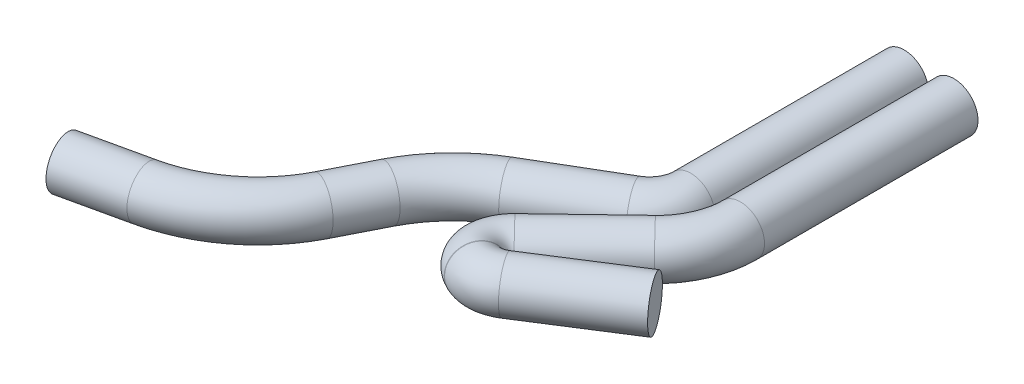
ISO-10303-21;
HEADER;
FILE_DESCRIPTION(('STEP AP214'),'2;1');
FILE_NAME('part.step','',(''),(''),'','','');
FILE_SCHEMA(('AUTOMOTIVE_DESIGN { 1 0 10303 214 1 1 1 1 }'));
ENDSEC;
DATA;
#1=APPLICATION_CONTEXT('core data for automotive mechanical design processes');
#2=APPLICATION_PROTOCOL_DEFINITION('international standard','automotive_design',2000,#1);
#3=PRODUCT_CONTEXT('',#1,'mechanical');
#4=PRODUCT('Part','Part','',(#3));
#5=PRODUCT_RELATED_PRODUCT_CATEGORY('part','',(#4));
#6=PRODUCT_DEFINITION_FORMATION('','',#4);
#7=PRODUCT_DEFINITION_CONTEXT('part definition',#1,'design');
#8=PRODUCT_DEFINITION('design','',#6,#7);
#9=PRODUCT_DEFINITION_SHAPE('','',#8);
#10=(LENGTH_UNIT() NAMED_UNIT(*) SI_UNIT(.MILLI.,.METRE.));
#11=(NAMED_UNIT(*) PLANE_ANGLE_UNIT() SI_UNIT($,.RADIAN.));
#12=(NAMED_UNIT(*) SI_UNIT($,.STERADIAN.) SOLID_ANGLE_UNIT());
#13=UNCERTAINTY_MEASURE_WITH_UNIT(LENGTH_MEASURE(1.E-05),#10,'distance_accuracy_value','');
#14=(GEOMETRIC_REPRESENTATION_CONTEXT(3) GLOBAL_UNCERTAINTY_ASSIGNED_CONTEXT((#13)) GLOBAL_UNIT_ASSIGNED_CONTEXT((#10,
#11,#12)) REPRESENTATION_CONTEXT('',''));
#15=CARTESIAN_POINT('',(0.,0.,0.));
#16=DIRECTION('',(0.,0.,1.));
#17=DIRECTION('',(1.,0.,0.));
#18=AXIS2_PLACEMENT_3D('',#15,#16,#17);
#19=CARTESIAN_POINT('',(-21.6730241089946,0.500000000000016,25.2337808568978));
#20=DIRECTION('',(-0.976296007119932,0.,0.216439613938107));
#21=DIRECTION('',(0.216439613938107,0.,0.976296007119932));
#22=AXIS2_PLACEMENT_3D('',#19,#20,#21);
#23=CYLINDRICAL_SURFACE('',#22,1.75);
#24=CARTESIAN_POINT('',(-21.6730241089946,0.500000000000016,25.2337808568978));
#25=DIRECTION('',(-0.976296007119932,0.,0.216439613938108));
#26=DIRECTION('',(0.216433231921712,0.00767931316880695,0.976267219704307));
#27=AXIS2_PLACEMENT_3D('',#24,#25,#26);
#28=CIRCLE('',#27,1.75);
#29=CARTESIAN_POINT('',(-21.2947599299172,0.590350167886694,26.9400203060929));
#30=VERTEX_POINT('',#29);
#31=EDGE_CURVE('E104',#30,#30,#28,.T.);
#32=ORIENTED_EDGE('',*,*,#31,.T.);
#33=EDGE_LOOP('',(#32));
#34=FACE_BOUND('',#33,.T.);
#35=CARTESIAN_POINT('',(-26.4820698293765,0.500000000000019,26.2999206255124));
#36=DIRECTION('',(-0.976296007119932,0.,0.216439613938108));
#37=DIRECTION('',(0.216439613938108,0.,0.976296007119932));
#38=AXIS2_PLACEMENT_3D('',#35,#36,#37);
#39=CIRCLE('',#38,1.75);
#40=CARTESIAN_POINT('',(-26.1033005049849,0.500000000000019,28.0084386379723));
#41=VERTEX_POINT('',#40);
#42=EDGE_CURVE('E341',#41,#41,#39,.T.);
#43=ORIENTED_EDGE('',*,*,#42,.F.);
#44=EDGE_LOOP('',(#43));
#45=FACE_BOUND('',#44,.T.);
#46=ADVANCED_FACE('F37',(#34,#45),#23,.T.);
#47=CARTESIAN_POINT('',(-1.8,0.,-10.));
#48=DIRECTION('',(0.,0.,1.));
#49=DIRECTION('',(1.,0.,0.));
#50=AXIS2_PLACEMENT_3D('',#47,#48,#49);
#51=CYLINDRICAL_SURFACE('',#50,1.75);
#52=CARTESIAN_POINT('',(-1.8,0.,-10.));
#53=DIRECTION('',(0.,0.,1.));
#54=DIRECTION('',(1.,0.,0.));
#55=AXIS2_PLACEMENT_3D('',#52,#53,#54);
#56=CIRCLE('',#55,1.75);
#57=CARTESIAN_POINT('',(-0.0499999999999997,0.,-10.));
#58=VERTEX_POINT('',#57);
#59=EDGE_CURVE('E64',#58,#58,#56,.T.);
#60=ORIENTED_EDGE('',*,*,#59,.T.);
#61=EDGE_LOOP('',(#60));
#62=FACE_BOUND('',#61,.T.);
#63=CARTESIAN_POINT('',(-1.8,0.,5.5));
#64=DIRECTION('',(0.,0.,1.));
#65=DIRECTION('',(1.,0.,0.));
#66=AXIS2_PLACEMENT_3D('',#63,#64,#65);
#67=CIRCLE('',#66,1.75);
#68=CARTESIAN_POINT('',(-0.0499999999999995,0.,5.5));
#69=VERTEX_POINT('',#68);
#70=EDGE_CURVE('E89',#69,#69,#67,.T.);
#71=ORIENTED_EDGE('',*,*,#70,.F.);
#72=EDGE_LOOP('',(#71));
#73=FACE_BOUND('',#72,.T.);
#74=ADVANCED_FACE('F39',(#62,#73),#51,.T.);
#75=CARTESIAN_POINT('',(-1.8,0.,-10.));
#76=DIRECTION('',(0.,0.,1.));
#77=DIRECTION('',(1.,0.,0.));
#78=AXIS2_PLACEMENT_3D('',#75,#76,#77);
#79=PLANE('',#78);
#80=ORIENTED_EDGE('',*,*,#59,.F.);
#81=EDGE_LOOP('',(#80));
#82=FACE_BOUND('',#81,.T.);
#83=ADVANCED_FACE('F155',(#82),#79,.F.);
#84=CARTESIAN_POINT('',(-23.8345337037226,-0.016286673638144,15.4838411472113));
#85=DIRECTION('',(0.0111744888323627,-0.998666351043349,0.0504048618002169));
#86=DIRECTION('',(0.,-0.050408009102372,-0.99872870821777));
#87=AXIS2_PLACEMENT_3D('',#84,#85,#86);
#88=TOROIDAL_SURFACE('',#87,10.,1.75);
#89=CARTESIAN_POINT('',(-14.6790347620915,0.288575292282886,19.4943147241753));
#90=DIRECTION('',(-0.40204915383228,0.0416666666666678,0.914669539665357));
#91=DIRECTION('',(0.915156111314764,-0.0134427207983108,0.402875396594006));
#92=AXIS2_PLACEMENT_3D('',#89,#90,#91);
#93=CIRCLE('',#92,1.75);
#94=CARTESIAN_POINT('',(-13.076822447306,0.341926136319067,20.196147600144));
#95=VERTEX_POINT('',#94);
#96=EDGE_CURVE('E101',#95,#95,#93,.T.);
#97=CARTESIAN_POINT('',(-23.8345337037226,-0.016286673638144,15.4838411472113));
#98=DIRECTION('',(0.0111744888323627,-0.998666351043349,0.0504048618002169));
#99=DIRECTION('',(0.,-0.050408009102372,-0.99872870821777));
#100=AXIS2_PLACEMENT_3D('',#97,#98,#99);
#101=CIRCLE('',#100,11.75);
#102=EDGE_CURVE('',#95,#30,#101,.T.);
#103=ORIENTED_EDGE('',*,*,#96,.T.);
#104=ORIENTED_EDGE('',*,*,#31,.F.);
#105=ORIENTED_EDGE('',*,*,#102,.T.);
#106=ORIENTED_EDGE('',*,*,#102,.F.);
#107=EDGE_LOOP('',(#103,#105,#104,#106));
#108=FACE_BOUND('',#107,.T.);
#109=ADVANCED_FACE('F159',(#108),#88,.T.);
#110=CARTESIAN_POINT('',(-13.1949278399274,0.134768754365635,16.1179429985523));
#111=DIRECTION('',(-0.402049153832282,0.0416666666666677,0.914669539665356));
#112=DIRECTION('',(0.915464558972045,0.,0.402398609920709));
#113=AXIS2_PLACEMENT_3D('',#110,#111,#112);
#114=CYLINDRICAL_SURFACE('',#113,1.75);
#115=CARTESIAN_POINT('',(-13.1949278399274,0.134768754365635,16.1179429985523));
#116=DIRECTION('',(-0.40204915383228,0.0416666666666678,0.914669539665357));
#117=DIRECTION('',(0.915156111314764,-0.0134427207983108,0.402875396594006));
#118=AXIS2_PLACEMENT_3D('',#115,#116,#117);
#119=CIRCLE('',#118,1.75);
#120=CARTESIAN_POINT('',(-14.7960133175948,0.0338422207240908,15.4187726845302));
#121=VERTEX_POINT('',#120);
#122=EDGE_CURVE('E98',#121,#121,#119,.T.);
#123=ORIENTED_EDGE('',*,*,#122,.T.);
#124=EDGE_LOOP('',(#123));
#125=FACE_BOUND('',#124,.T.);
#126=ORIENTED_EDGE('',*,*,#96,.F.);
#127=EDGE_LOOP('',(#126));
#128=FACE_BOUND('',#127,.T.);
#129=ADVANCED_FACE('F166',(#125,#128),#114,.T.);
#130=CARTESIAN_POINT('',(-4.04586796754242,0.71149180374589,20.1132019358213));
#131=DIRECTION('',(-0.0361041883704825,0.997465685691505,-0.0613081842014956));
#132=DIRECTION('',(0.,0.0613481812979924,0.998116426400963));
#133=AXIS2_PLACEMENT_3D('',#130,#131,#132);
#134=TOROIDAL_SURFACE('',#133,10.,1.75);
#135=CARTESIAN_POINT('',(-9.10744265044075,0.,11.5181893620873));
#136=DIRECTION('',(-0.861685038094858,0.,0.507443489586243));
#137=DIRECTION('',(0.507443489586243,0.,0.861685038094858));
#138=AXIS2_PLACEMENT_3D('',#135,#136,#137);
#139=CIRCLE('',#138,1.75);
#140=CARTESIAN_POINT('',(-9.99321821994795,-0.124511065655531,10.0140621616839));
#141=VERTEX_POINT('',#140);
#142=EDGE_CURVE('E95',#141,#141,#139,.T.);
#143=CARTESIAN_POINT('',(-4.04586796754242,0.71149180374589,20.1132019358213));
#144=DIRECTION('',(-0.0361041883704825,0.997465685691505,-0.0613081842014956));
#145=DIRECTION('',(0.,0.0613481812979924,0.998116426400963));
#146=AXIS2_PLACEMENT_3D('',#143,#144,#145);
#147=CIRCLE('',#146,11.75);
#148=EDGE_CURVE('',#141,#121,#147,.T.);
#149=ORIENTED_EDGE('',*,*,#142,.T.);
#150=ORIENTED_EDGE('',*,*,#122,.F.);
#151=ORIENTED_EDGE('',*,*,#148,.T.);
#152=ORIENTED_EDGE('',*,*,#148,.F.);
#153=EDGE_LOOP('',(#149,#151,#150,#152));
#154=FACE_BOUND('',#153,.T.);
#155=ADVANCED_FACE('F178',(#154),#134,.T.);
#156=CARTESIAN_POINT('',(-3.27766953124127,0.,8.08505511428457));
#157=DIRECTION('',(-0.861685038094857,0.,0.507443489586244));
#158=DIRECTION('',(0.507443489586244,0.,0.861685038094857));
#159=AXIS2_PLACEMENT_3D('',#156,#157,#158);
#160=CYLINDRICAL_SURFACE('',#159,1.75);
#161=CARTESIAN_POINT('',(-3.27766953124127,0.,8.08505511428457));
#162=DIRECTION('',(-0.861685038094858,0.,0.507443489586243));
#163=DIRECTION('',(0.507443489586243,0.,0.861685038094858));
#164=AXIS2_PLACEMENT_3D('',#161,#162,#163);
#165=CIRCLE('',#164,1.75);
#166=CARTESIAN_POINT('',(-2.38964342446534,0.,9.59300393095057));
#167=VERTEX_POINT('',#166);
#168=EDGE_CURVE('E92',#167,#167,#165,.T.);
#169=ORIENTED_EDGE('',*,*,#168,.T.);
#170=EDGE_LOOP('',(#169));
#171=FACE_BOUND('',#170,.T.);
#172=ORIENTED_EDGE('',*,*,#142,.F.);
#173=EDGE_LOOP('',(#172));
#174=FACE_BOUND('',#173,.T.);
#175=ADVANCED_FACE('F173',(#171,#174),#160,.T.);
#176=CARTESIAN_POINT('',(-4.8,0.,5.5));
#177=DIRECTION('',(0.,-1.,0.));
#178=DIRECTION('',(0.,0.,-1.));
#179=AXIS2_PLACEMENT_3D('',#176,#177,#178);
#180=TOROIDAL_SURFACE('',#179,3.,1.75);
#181=CARTESIAN_POINT('',(-0.999341230949511,0.18416013869741,8.33289183997176));
#182=CARTESIAN_POINT('',(-1.01201693799096,0.199116564470194,8.34723658798658));
#183=CARTESIAN_POINT('',(-1.02538865045457,0.212649292814823,8.36227541868743));
#184=CARTESIAN_POINT('',(-1.05311412252572,0.237333805152229,8.39324639939902));
#185=CARTESIAN_POINT('',(-1.06746387706323,0.248494609696739,8.40917486304715));
#186=CARTESIAN_POINT('',(-1.11124016944338,0.279066913592445,8.45741882562102));
#187=CARTESIAN_POINT('',(-1.14165417137557,0.295838701702347,8.49048878492593));
#188=CARTESIAN_POINT('',(-1.18695530793059,0.316493047418901,8.53901910366807));
#189=CARTESIAN_POINT('',(-1.20125909176298,0.322414989648062,8.55424177260462));
#190=CARTESIAN_POINT('',(-1.24997805227185,0.34080326904788,8.60574166904313));
#191=CARTESIAN_POINT('',(-1.28503334719416,0.351087204193428,8.64222107634737));
#192=CARTESIAN_POINT('',(-1.35622983110374,0.367307071372705,8.71510896500459));
#193=CARTESIAN_POINT('',(-1.39237258396124,0.373236396151344,8.75151725532436));
#194=CARTESIAN_POINT('',(-1.50234724472071,0.38527257444411,8.86047877851621));
#195=CARTESIAN_POINT('',(-1.5774680965545,0.385541045793297,8.93249586529784));
#196=CARTESIAN_POINT('',(-1.70441817210852,0.373058808175953,9.05024940163594));
#197=CARTESIAN_POINT('',(-1.75587259900185,0.364515967425142,9.09691226368289));
#198=CARTESIAN_POINT('',(-1.85845034954278,0.339199686774759,9.18791824376531));
#199=CARTESIAN_POINT('',(-1.9095736245079,0.322480763249914,9.23227460316582));
#200=CARTESIAN_POINT('',(-1.97722706251196,0.292210517800513,9.28976908584691));
#201=CARTESIAN_POINT('',(-1.99466829996976,0.283649347079344,9.30447935817896));
#202=CARTESIAN_POINT('',(-2.02919321888413,0.264783179110377,9.33339188382785));
#203=CARTESIAN_POINT('',(-2.04627499623965,0.254470697008226,9.34759162556335));
#204=CARTESIAN_POINT('',(-2.08388595817449,0.228936927283499,9.3786431775259));
#205=CARTESIAN_POINT('',(-2.10421022913854,0.213132927592518,9.39527125949946));
#206=CARTESIAN_POINT('',(-2.14253439555145,0.177203655838755,9.42638355205068));
#207=CARTESIAN_POINT('',(-2.16055149320483,0.157113754941245,9.44088376294909));
#208=CARTESIAN_POINT('',(-2.18185481585708,0.125600934754252,9.45793050665013));
#209=CARTESIAN_POINT('',(-2.18729886830631,0.116632036933378,9.46227519775079));
#210=CARTESIAN_POINT('',(-2.19722648393701,0.0978395656506297,9.47018332006891));
#211=CARTESIAN_POINT('',(-2.20170998374762,0.0880159358593348,9.47374669974103));
#212=CARTESIAN_POINT('',(-2.20944465367369,0.0674414031575244,9.47988563244145));
#213=CARTESIAN_POINT('',(-2.21268057559162,0.0566808834761982,9.48244896692395));
#214=CARTESIAN_POINT('',(-2.2174888415854,0.0345718542987436,9.48625527557658));
#215=CARTESIAN_POINT('',(-2.21906423783449,0.0232244639499628,9.4875006722342));
#216=CARTESIAN_POINT('',(-2.22027993802205,0.00148671173650923,9.48846180110229));
#217=CARTESIAN_POINT('',(-2.22009566516098,-0.00888774230565977,9.48831620234158));
#218=CARTESIAN_POINT('',(-2.21823160883304,-0.0294163082985097,9.48684224130296));
#219=CARTESIAN_POINT('',(-2.21655085431559,-0.0395702727927195,9.48551311104434));
#220=CARTESIAN_POINT('',(-2.21154624302972,-0.0607568888707527,9.48155043820392));
#221=CARTESIAN_POINT('',(-2.20802439058459,-0.0717120163758923,9.47875960994948));
#222=CARTESIAN_POINT('',(-2.19964617502628,-0.0927466013662958,9.47210682888979));
#223=CARTESIAN_POINT('',(-2.19478755658706,-0.102824540736129,9.46824306577809));
#224=CARTESIAN_POINT('',(-2.18113173704633,-0.127385851573579,9.45735633198317));
#225=CARTESIAN_POINT('',(-2.17164164950334,-0.141226602844019,9.44976738107559));
#226=CARTESIAN_POINT('',(-2.15121242403563,-0.166955225220584,9.43335522147027));
#227=CARTESIAN_POINT('',(-2.14026936340449,-0.178837607309165,9.42452866777074));
#228=CARTESIAN_POINT('',(-2.10689480345488,-0.211290335872133,9.39747269332979));
#229=CARTESIAN_POINT('',(-2.08324562392336,-0.229660520446365,9.37813420739802));
#230=CARTESIAN_POINT('',(-2.03450417343822,-0.262122935564802,9.33785006097093));
#231=CARTESIAN_POINT('',(-2.00940841801166,-0.276204275396882,9.31690047541019));
#232=CARTESIAN_POINT('',(-1.92912354321242,-0.315610131005968,9.24913311298629));
#233=CARTESIAN_POINT('',(-1.87269237296857,-0.335107095089076,9.20041508217805));
#234=CARTESIAN_POINT('',(-1.75955998553434,-0.364091926976783,9.10030386250673));
#235=CARTESIAN_POINT('',(-1.70285871624312,-0.373533503268674,9.04889943440659));
#236=CARTESIAN_POINT('',(-1.57185626264519,-0.385613767934071,8.92714938652393));
#237=CARTESIAN_POINT('',(-1.49785892868228,-0.385020990938449,8.85610361755715));
#238=CARTESIAN_POINT('',(-1.38956565521248,-0.37280315556052,8.74869757429932));
#239=CARTESIAN_POINT('',(-1.35401240547766,-0.366874130757045,8.71285565462615));
#240=CARTESIAN_POINT('',(-1.28396571124649,-0.350767896737743,8.64111059342808));
#241=CARTESIAN_POINT('',(-1.24947123845214,-0.340594959071213,8.60520754951152));
#242=CARTESIAN_POINT('',(-1.19113867945884,-0.318607563337716,8.54354249412093));
#243=CARTESIAN_POINT('',(-1.16695947751056,-0.307996987540352,8.51768460389285));
#244=CARTESIAN_POINT('',(-1.1196391447596,-0.283301360867516,8.46652924140291));
#245=CARTESIAN_POINT('',(-1.09650173480697,-0.269204869140209,8.44123391959555));
#246=CARTESIAN_POINT('',(-1.07410329531772,-0.253012063448245,8.41648057052417));
#247=B_SPLINE_CURVE_WITH_KNOTS('',3,(#181,#182,#183,#184,#185,#186,#187,#188,#189,#190,#191,
#192,#193,#194,#195,#196,#197,#198,#199,#200,#201,#202,#203,#204,#205,#206,#207,#208,#209,#210,
#211,#212,#213,#214,#215,#216,#217,#218,#219,#220,#221,#222,#223,#224,#225,#226,#227,#228,#229,
#230,#231,#232,#233,#234,#235,#236,#237,#238,#239,#240,#241,#242,#243,#244,#245,#246),
.UNSPECIFIED.,.F.,.F.,(4,2,2,2,2,2,2,2,2,2,2,2,2,2,2,2,2,2,2,2,2,2,2,2,2,2,2,2,2,2,2,2,4),(0.,
0.072664025477547,0.145046554644328,0.288398775785863,0.353528375451903,0.508109267731014,
0.662924223917625,0.973697414087225,1.18334853890167,1.39162043176098,1.4646800779541,
1.53806021289672,1.62977319158429,1.72075668710165,1.75474699347386,1.78873954160916,
1.82313529519857,1.85746771592035,1.88841624835323,1.91938487759808,1.954713022422,
1.99010114057613,2.04504260011275,2.10013552574537,2.20647676691232,2.3130858325273,
2.54297129373735,2.77391055271244,3.08031965552405,3.23268882181734,3.38490499531855,
3.49561761531066,3.60669853458815),.UNSPECIFIED.);
#248=CARTESIAN_POINT('',(-1.23820623824529,0.335939691524246,8.59321632400415));
#249=VERTEX_POINT('',#248);
#250=CARTESIAN_POINT('',(-1.23820623824529,-0.335939691524245,8.59321632400415));
#251=VERTEX_POINT('',#250);
#252=EDGE_CURVE('E11',#249,#251,#247,.T.);
#253=ORIENTED_EDGE('',*,*,#252,.F.);
#254=CARTESIAN_POINT('',(-1.26091568045415,-0.343589149947103,8.61688344392306));
#255=CARTESIAN_POINT('',(-1.22655170981285,-0.332122521051225,8.58133474743801));
#256=CARTESIAN_POINT('',(-1.19282723513932,-0.320324350913217,8.54526591492956));
#257=CARTESIAN_POINT('',(-1.12674242920387,-0.295695564901048,8.47222507871951));
#258=CARTESIAN_POINT('',(-1.09438246344184,-0.282864675044351,8.43525283716557));
#259=CARTESIAN_POINT('',(-1.02162278174791,-0.251739733984654,8.34933449580082));
#260=CARTESIAN_POINT('',(-0.981730601505803,-0.232962904957482,8.30013008265861));
#261=CARTESIAN_POINT('',(-0.917449805033595,-0.197872822712167,8.21737727150417));
#262=CARTESIAN_POINT('',(-0.892260299412626,-0.18276468264548,8.18397564330465));
#263=CARTESIAN_POINT('',(-0.851445158689883,-0.154131249205486,8.12830868527425));
#264=CARTESIAN_POINT('',(-0.835318680740911,-0.141621940800563,8.10586907437975));
#265=CARTESIAN_POINT('',(-0.804648203333607,-0.113779685225514,8.06236761020212));
#266=CARTESIAN_POINT('',(-0.790074202290157,-0.0985274909044213,8.04128517467806));
#267=CARTESIAN_POINT('',(-0.774495999198206,-0.0756792479724615,8.01839873573419));
#268=CARTESIAN_POINT('',(-0.771827523110063,-0.0714844186193391,8.01446330594509));
#269=CARTESIAN_POINT('',(-0.766733709453414,-0.0626373024779228,8.00692767433987));
#270=CARTESIAN_POINT('',(-0.764309031186257,-0.0579838392397092,8.00332838331729));
#271=CARTESIAN_POINT('',(-0.759790695208797,-0.0480537231141835,7.99660272003485));
#272=CARTESIAN_POINT('',(-0.757703284447217,-0.0427679123795141,7.99348531077917));
#273=CARTESIAN_POINT('',(-0.754141132892114,-0.0315743868392537,7.98815467669087));
#274=CARTESIAN_POINT('',(-0.752662623549659,-0.0256707899351183,7.98593589164976));
#275=CARTESIAN_POINT('',(-0.751029627924217,-0.0159152000102647,7.98348304780255));
#276=CARTESIAN_POINT('',(-0.750580450924669,-0.0122244478927429,7.98280766863201));
#277=CARTESIAN_POINT('',(-0.75003757193953,-0.00475816331479859,7.98199129631575));
#278=CARTESIAN_POINT('',(-0.749943594093006,-0.000982698938554236,7.98184988846803));
#279=CARTESIAN_POINT('',(-0.75012254875764,0.00653847446504381,7.98211906075823));
#280=CARTESIAN_POINT('',(-0.750395451739716,0.0102841858627134,7.98252959647195));
#281=CARTESIAN_POINT('',(-0.7512761435612,0.0176454672161362,7.9838533638278));
#282=CARTESIAN_POINT('',(-0.751884345951117,0.0212608705745289,7.98476721624773));
#283=CARTESIAN_POINT('',(-0.753700223103836,0.0298106685176808,7.9874923775991));
#284=CARTESIAN_POINT('',(-0.755053208689594,0.0346438741103851,7.98952061323371));
#285=CARTESIAN_POINT('',(-0.758159655110029,0.0438750887528888,7.99416660570361));
#286=CARTESIAN_POINT('',(-0.75991411622794,0.0482719707909699,7.9967858347778));
#287=CARTESIAN_POINT('',(-0.765419691214089,0.0605167642699226,8.00498264498039));
#288=CARTESIAN_POINT('',(-0.769530766974514,0.0678483980793411,8.01107711092735));
#289=CARTESIAN_POINT('',(-0.77828420852072,0.0814951099992123,8.02397610373184));
#290=CARTESIAN_POINT('',(-0.782928586299347,0.0878061066697321,8.03078331043618));
#291=CARTESIAN_POINT('',(-0.805440244081867,0.115881458984262,8.06356247037129));
#292=CARTESIAN_POINT('',(-0.825191267246055,0.13342465665248,8.09171320019813));
#293=CARTESIAN_POINT('',(-0.866289728020245,0.165229427485155,8.14879713111823));
#294=CARTESIAN_POINT('',(-0.887651116154307,0.179456546467255,8.17773533478993));
#295=CARTESIAN_POINT('',(-0.936715507831637,0.209023179261449,8.24252246544476));
#296=CARTESIAN_POINT('',(-0.964726852036387,0.22383501893526,8.27839322197473));
#297=CARTESIAN_POINT('',(-1.02218608395667,0.251740752078257,8.34967951312763));
#298=CARTESIAN_POINT('',(-1.05163578445985,0.264832396688957,8.38509439830727));
#299=CARTESIAN_POINT('',(-1.11049600453001,0.289285363855094,8.45368708811128));
#300=CARTESIAN_POINT('',(-1.1398505795811,0.300697622002165,8.48689453412687));
#301=CARTESIAN_POINT('',(-1.19960495378983,0.322691500511338,8.5525024245064));
#302=CARTESIAN_POINT('',(-1.23000241691498,0.333274822657185,8.58490442375539));
#303=CARTESIAN_POINT('',(-1.26091568044779,0.343589149971309,8.61688344391684));
#304=B_SPLINE_CURVE_WITH_KNOTS('',3,(#254,#255,#256,#257,#258,#259,#260,#261,#262,#263,#264,
#265,#266,#267,#268,#269,#270,#271,#272,#273,#274,#275,#276,#277,#278,#279,#280,#281,#282,#283,
#284,#285,#286,#287,#288,#289,#290,#291,#292,#293,#294,#295,#296,#297,#298,#299,#300,#301,#302,
#303),.UNSPECIFIED.,.F.,.F.,(4,2,2,2,2,2,2,2,2,2,2,2,2,2,2,2,2,2,2,2,2,2,2,2,4),(0.,
0.152266496596787,0.30457352379417,0.502667064437306,0.63592522902316,0.726948131319614,
0.815633765409948,0.834633117096893,0.853682539722517,0.873052060172383,0.892299830850882,
0.90358750051858,0.914866401956822,0.926144395646163,0.93743633057238,0.953582959374475,
0.969770264457568,1.00074351735781,1.03183772051241,1.14678275551107,1.2628735575293,
1.40631627734348,1.54994469653844,1.68721677952385,1.82419922779386),.UNSPECIFIED.);
#305=EDGE_CURVE('E50',#251,#249,#304,.T.);
#306=ORIENTED_EDGE('',*,*,#305,.F.);
#307=EDGE_LOOP('',(#253,#306));
#308=FACE_BOUND('',#307,.T.);
#309=ORIENTED_EDGE('',*,*,#70,.T.);
#310=EDGE_LOOP('',(#309));
#311=FACE_BOUND('',#310,.T.);
#312=ORIENTED_EDGE('',*,*,#168,.F.);
#313=EDGE_LOOP('',(#312));
#314=FACE_BOUND('',#313,.T.);
#315=ADVANCED_FACE('F56',(#308,#311,#314),#180,.T.);
#316=CARTESIAN_POINT('',(-2.77271721280659,0.500000000000006,17.9530957942329));
#317=DIRECTION('',(0.843391445812879,0.,-0.537299608346835));
#318=DIRECTION('',(-0.537299608346835,0.,-0.843391445812879));
#319=AXIS2_PLACEMENT_3D('',#316,#317,#318);
#320=CYLINDRICAL_SURFACE('',#319,1.75);
#321=CARTESIAN_POINT('',(-2.77271721280659,0.500000000000006,17.9530957942329));
#322=DIRECTION('',(0.84339144581288,0.,-0.537299608346833));
#323=DIRECTION('',(-0.520956991309876,-0.24475962024533,-0.817738675557616));
#324=AXIS2_PLACEMENT_3D('',#321,#322,#323);
#325=CIRCLE('',#324,1.75);
#326=CARTESIAN_POINT('',(-1.8422592102056,0.752210682448657,19.4136223010292));
#327=VERTEX_POINT('',#326);
#328=EDGE_CURVE('E83',#327,#327,#325,.T.);
#329=ORIENTED_EDGE('',*,*,#328,.T.);
#330=EDGE_LOOP('',(#329));
#331=FACE_BOUND('',#330,.T.);
#332=CARTESIAN_POINT('',(3.840997285992,0.500000000000007,13.7396949735768));
#333=DIRECTION('',(0.843391445812881,0.,-0.537299608346831));
#334=DIRECTION('',(-0.537299608346831,0.,-0.843391445812881));
#335=AXIS2_PLACEMENT_3D('',#332,#333,#334);
#336=CIRCLE('',#335,1.74999999999999);
#337=CARTESIAN_POINT('',(2.90072297138506,0.500000000000007,12.2637599434043));
#338=VERTEX_POINT('',#337);
#339=EDGE_CURVE('E74',#338,#338,#336,.T.);
#340=ORIENTED_EDGE('',*,*,#339,.F.);
#341=EDGE_LOOP('',(#340));
#342=FACE_BOUND('',#341,.T.);
#343=ADVANCED_FACE('F137',(#331,#342),#320,.T.);
#344=CARTESIAN_POINT('',(1.8,0.,-10.));
#345=DIRECTION('',(0.,0.,1.));
#346=DIRECTION('',(1.,0.,0.));
#347=AXIS2_PLACEMENT_3D('',#344,#345,#346);
#348=CYLINDRICAL_SURFACE('',#347,1.75);
#349=CARTESIAN_POINT('',(1.8,0.,-10.));
#350=DIRECTION('',(0.,0.,1.));
#351=DIRECTION('',(1.,0.,0.));
#352=AXIS2_PLACEMENT_3D('',#349,#350,#351);
#353=CIRCLE('',#352,1.75);
#354=CARTESIAN_POINT('',(3.55,0.,-10.));
#355=VERTEX_POINT('',#354);
#356=EDGE_CURVE('E86',#355,#355,#353,.T.);
#357=ORIENTED_EDGE('',*,*,#356,.T.);
#358=EDGE_LOOP('',(#357));
#359=FACE_BOUND('',#358,.T.);
#360=CARTESIAN_POINT('',(1.8,0.,5.5));
#361=DIRECTION('',(0.,0.,1.));
#362=DIRECTION('',(1.,0.,0.));
#363=AXIS2_PLACEMENT_3D('',#360,#361,#362);
#364=CIRCLE('',#363,1.75);
#365=CARTESIAN_POINT('',(3.55,0.,5.5));
#366=VERTEX_POINT('',#365);
#367=EDGE_CURVE('E68',#366,#366,#364,.T.);
#368=ORIENTED_EDGE('',*,*,#367,.F.);
#369=EDGE_LOOP('',(#368));
#370=FACE_BOUND('',#369,.T.);
#371=ADVANCED_FACE('F140',(#359,#370),#348,.T.);
#372=CARTESIAN_POINT('',(1.8,0.,-10.));
#373=DIRECTION('',(0.,0.,1.));
#374=DIRECTION('',(1.,0.,0.));
#375=AXIS2_PLACEMENT_3D('',#372,#373,#374);
#376=PLANE('',#375);
#377=ORIENTED_EDGE('',*,*,#356,.F.);
#378=EDGE_LOOP('',(#377));
#379=FACE_BOUND('',#378,.T.);
#380=ADVANCED_FACE('F135',(#379),#376,.F.);
#381=CARTESIAN_POINT('',(-3.83609778720772,0.211759220058691,16.2839226436086));
#382=DIRECTION('',(-0.0774358290860273,0.989560161483225,-0.12154990406847));
#383=DIRECTION('',(0.,0.121915976514211,0.992540424703491));
#384=AXIS2_PLACEMENT_3D('',#381,#382,#383);
#385=TOROIDAL_SURFACE('',#384,1.99999999999999,1.75);
#386=CARTESIAN_POINT('',(-4.76981654796808,0.355226105510269,18.0467574426136));
#387=DIRECTION('',(0.880934737267632,0.125000000000002,0.456430705228305));
#388=DIRECTION('',(0.472336655301841,-0.172753692918603,-0.864322998445173));
#389=AXIS2_PLACEMENT_3D('',#386,#387,#388);
#390=CIRCLE('',#389,1.75);
#391=CARTESIAN_POINT('',(-5.5868204636334,0.4807596302804,19.5892378917429));
#392=VERTEX_POINT('',#391);
#393=EDGE_CURVE('E80',#392,#392,#390,.T.);
#394=CARTESIAN_POINT('',(-3.83609778720772,0.211759220058691,16.2839226436086));
#395=DIRECTION('',(-0.0774358290860273,0.989560161483225,-0.12154990406847));
#396=DIRECTION('',(0.,0.121915976514211,0.992540424703491));
#397=AXIS2_PLACEMENT_3D('',#394,#395,#396);
#398=CIRCLE('',#397,3.74999999999999);
#399=EDGE_CURVE('',#392,#327,#398,.T.);
#400=ORIENTED_EDGE('',*,*,#393,.T.);
#401=ORIENTED_EDGE('',*,*,#328,.F.);
#402=ORIENTED_EDGE('',*,*,#399,.T.);
#403=ORIENTED_EDGE('',*,*,#399,.F.);
#404=EDGE_LOOP('',(#400,#402,#401,#403));
#405=FACE_BOUND('',#404,.T.);
#406=ADVANCED_FACE('F131',(#405),#385,.T.);
#407=CARTESIAN_POINT('',(-4.81682533402015,0.348555806329272,18.0224012077394));
#408=DIRECTION('',(0.880934737267585,0.12499999999999,0.456430705228398));
#409=DIRECTION('',(0.460038909245016,0.,-0.887898756604972));
#410=AXIS2_PLACEMENT_3D('',#407,#408,#409);
#411=CYLINDRICAL_SURFACE('',#410,1.75);
#412=CARTESIAN_POINT('',(-4.81682533402015,0.348555806329272,18.0224012077394));
#413=DIRECTION('',(0.880934737267632,0.125000000000002,0.456430705228305));
#414=DIRECTION('',(0.472336655301841,-0.172753692918603,-0.864322998445173));
#415=AXIS2_PLACEMENT_3D('',#412,#413,#414);
#416=CIRCLE('',#415,1.75);
#417=CARTESIAN_POINT('',(-5.62944398849455,0.422600271265477,19.57051888402));
#418=VERTEX_POINT('',#417);
#419=EDGE_CURVE('E71',#418,#418,#416,.T.);
#420=ORIENTED_EDGE('',*,*,#419,.T.);
#421=EDGE_LOOP('',(#420));
#422=FACE_BOUND('',#421,.T.);
#423=ORIENTED_EDGE('',*,*,#393,.F.);
#424=EDGE_LOOP('',(#423));
#425=FACE_BOUND('',#424,.T.);
#426=ADVANCED_FACE('F127',(#422,#425),#411,.T.);
#427=CARTESIAN_POINT('',(-3.88811830033511,0.263933560687895,16.2531238634187));
#428=DIRECTION('',(-0.0912677383919978,0.991254139404044,-0.0953175274708579));
#429=DIRECTION('',(0.,0.0957170129094511,0.99540858617941));
#430=AXIS2_PLACEMENT_3D('',#427,#428,#429);
#431=TOROIDAL_SURFACE('',#430,1.99999999999999,1.75);
#432=CARTESIAN_POINT('',(-5.25921371145782,0.,14.8211893505513));
#433=DIRECTION('',(-0.722284253828343,0.,0.691596310481507));
#434=DIRECTION('',(0.691596310481507,0.,0.722284253828343));
#435=AXIS2_PLACEMENT_3D('',#432,#433,#434);
#436=CIRCLE('',#435,1.75);
#437=CARTESIAN_POINT('',(-6.4589221961902,-0.23094186560191,13.5682466517923));
#438=VERTEX_POINT('',#437);
#439=EDGE_CURVE('E67',#438,#438,#436,.T.);
#440=CARTESIAN_POINT('',(-3.88811830033511,0.263933560687895,16.2531238634187));
#441=DIRECTION('',(-0.0912677383919978,0.991254139404044,-0.0953175274708579));
#442=DIRECTION('',(0.,0.0957170129094511,0.99540858617941));
#443=AXIS2_PLACEMENT_3D('',#440,#441,#442);
#444=CIRCLE('',#443,3.74999999999999);
#445=EDGE_CURVE('',#438,#418,#444,.T.);
#446=ORIENTED_EDGE('',*,*,#439,.T.);
#447=ORIENTED_EDGE('',*,*,#419,.F.);
#448=ORIENTED_EDGE('',*,*,#445,.T.);
#449=ORIENTED_EDGE('',*,*,#445,.F.);
#450=EDGE_LOOP('',(#446,#448,#447,#449));
#451=FACE_BOUND('',#450,.T.);
#452=ADVANCED_FACE('F124',(#451),#431,.T.);
#453=CARTESIAN_POINT('',(-0.0504221371109568,0.,9.83370552297006));
#454=DIRECTION('',(-0.722284253828344,0.,0.691596310481507));
#455=DIRECTION('',(0.691596310481507,0.,0.722284253828343));
#456=AXIS2_PLACEMENT_3D('',#453,#454,#455);
#457=CYLINDRICAL_SURFACE('',#456,1.75);
#458=CARTESIAN_POINT('',(-0.0504221371109568,0.,9.83370552297006));
#459=DIRECTION('',(-0.722284253828343,0.,0.691596310481507));
#460=DIRECTION('',(0.691596310481507,0.,0.722284253828343));
#461=AXIS2_PLACEMENT_3D('',#458,#459,#460);
#462=CIRCLE('',#461,1.75);
#463=EDGE_CURVE('E63',#251,#249,#462,.T.);
#464=ORIENTED_EDGE('',*,*,#463,.T.);
#465=ORIENTED_EDGE('',*,*,#252,.T.);
#466=EDGE_LOOP('',(#464,#465));
#467=FACE_BOUND('',#466,.T.);
#468=ORIENTED_EDGE('',*,*,#439,.F.);
#469=EDGE_LOOP('',(#468));
#470=FACE_BOUND('',#469,.T.);
#471=ADVANCED_FACE('F65',(#467,#470),#457,.T.);
#472=CARTESIAN_POINT('',(-4.2,0.,5.5));
#473=DIRECTION('',(0.,-1.,0.));
#474=DIRECTION('',(0.,0.,-1.));
#475=AXIS2_PLACEMENT_3D('',#472,#473,#474);
#476=TOROIDAL_SURFACE('',#475,6.,1.75);
#477=ORIENTED_EDGE('',*,*,#367,.T.);
#478=EDGE_LOOP('',(#477));
#479=FACE_BOUND('',#478,.T.);
#480=ORIENTED_EDGE('',*,*,#463,.F.);
#481=ORIENTED_EDGE('',*,*,#305,.T.);
#482=EDGE_LOOP('',(#480,#481));
#483=FACE_BOUND('',#482,.T.);
#484=ADVANCED_FACE('F62',(#479,#483),#476,.T.);
#485=CARTESIAN_POINT('',(3.840997285992,0.500000000000007,13.7396949735768));
#486=DIRECTION('',(0.843391445812881,0.,-0.537299608346831));
#487=DIRECTION('',(-0.537299608346831,0.,-0.843391445812881));
#488=AXIS2_PLACEMENT_3D('',#485,#486,#487);
#489=PLANE('',#488);
#490=ORIENTED_EDGE('',*,*,#339,.T.);
#491=EDGE_LOOP('',(#490));
#492=FACE_BOUND('',#491,.T.);
#493=ADVANCED_FACE('F118',(#492),#489,.T.);
#494=CARTESIAN_POINT('',(-26.4820698293765,0.500000000000019,26.2999206255124));
#495=DIRECTION('',(-0.976296007119932,0.,0.216439613938108));
#496=DIRECTION('',(0.216439613938108,0.,0.976296007119932));
#497=AXIS2_PLACEMENT_3D('',#494,#495,#496);
#498=PLANE('',#497);
#499=ORIENTED_EDGE('',*,*,#42,.T.);
#500=EDGE_LOOP('',(#499));
#501=FACE_BOUND('',#500,.T.);
#502=ADVANCED_FACE('F262',(#501),#498,.T.);
#503=CLOSED_SHELL('',(#46,#74,#83,#109,#129,#155,#175,#315,#343,#371,#380,#406,#426,#452,#471,
#484,#493,#502));
#504=MANIFOLD_SOLID_BREP('B2',#503);
#505=ADVANCED_BREP_SHAPE_REPRESENTATION('',(#18,#504),#14);
#506=SHAPE_DEFINITION_REPRESENTATION(#9,#505);
ENDSEC;
END-ISO-10303-21;
